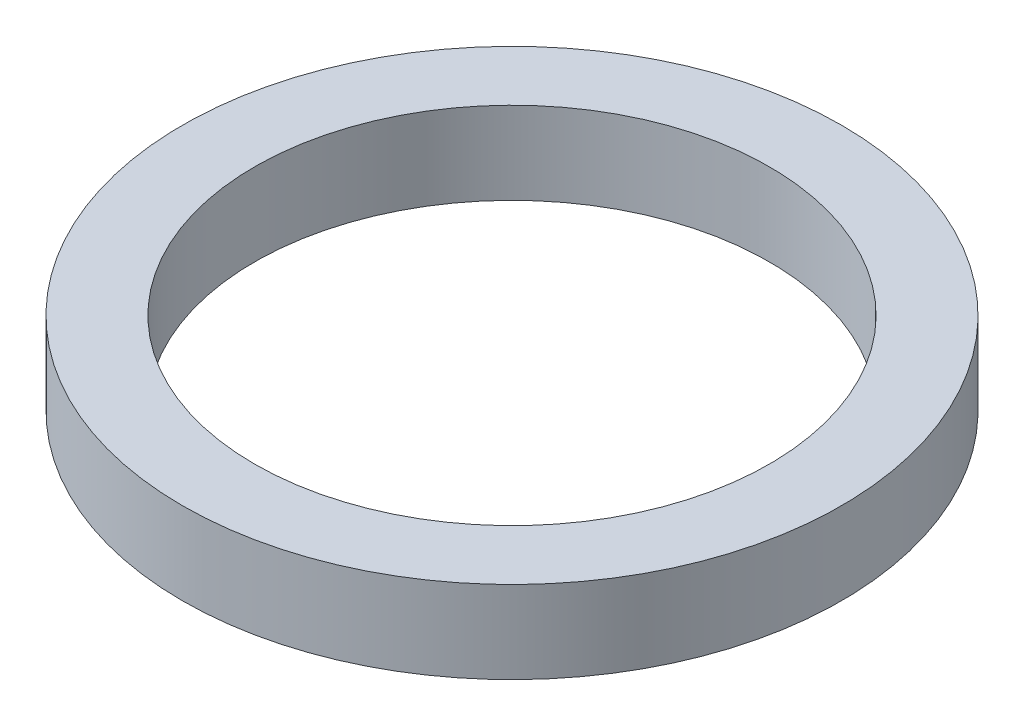
ISO-10303-21;
HEADER;
FILE_DESCRIPTION(('STEP AP214'),'2;1');
FILE_NAME('part.step','',(''),(''),'','','');
FILE_SCHEMA(('AUTOMOTIVE_DESIGN { 1 0 10303 214 1 1 1 1 }'));
ENDSEC;
DATA;
#1=APPLICATION_CONTEXT('core data for automotive mechanical design processes');
#2=APPLICATION_PROTOCOL_DEFINITION('international standard','automotive_design',2000,#1);
#3=PRODUCT_CONTEXT('',#1,'mechanical');
#4=PRODUCT('Part','Part','',(#3));
#5=PRODUCT_RELATED_PRODUCT_CATEGORY('part','',(#4));
#6=PRODUCT_DEFINITION_FORMATION('','',#4);
#7=PRODUCT_DEFINITION_CONTEXT('part definition',#1,'design');
#8=PRODUCT_DEFINITION('design','',#6,#7);
#9=PRODUCT_DEFINITION_SHAPE('','',#8);
#10=(LENGTH_UNIT() NAMED_UNIT(*) SI_UNIT(.MILLI.,.METRE.));
#11=(NAMED_UNIT(*) PLANE_ANGLE_UNIT() SI_UNIT($,.RADIAN.));
#12=(NAMED_UNIT(*) SI_UNIT($,.STERADIAN.) SOLID_ANGLE_UNIT());
#13=UNCERTAINTY_MEASURE_WITH_UNIT(LENGTH_MEASURE(1.E-05),#10,'distance_accuracy_value','');
#14=(GEOMETRIC_REPRESENTATION_CONTEXT(3) GLOBAL_UNCERTAINTY_ASSIGNED_CONTEXT((#13)) GLOBAL_UNIT_ASSIGNED_CONTEXT((#10,
#11,#12)) REPRESENTATION_CONTEXT('',''));
#15=CARTESIAN_POINT('',(0.,0.,0.));
#16=DIRECTION('',(0.,0.,1.));
#17=DIRECTION('',(1.,0.,0.));
#18=AXIS2_PLACEMENT_3D('',#15,#16,#17);
#19=CARTESIAN_POINT('',(0.,4.,0.));
#20=DIRECTION('',(0.,1.,0.));
#21=DIRECTION('',(0.,0.,1.));
#22=AXIS2_PLACEMENT_3D('',#19,#20,#21);
#23=PLANE('',#22);
#24=CARTESIAN_POINT('',(0.,4.,0.));
#25=DIRECTION('',(0.,1.,0.));
#26=DIRECTION('',(0.,0.,1.));
#27=AXIS2_PLACEMENT_3D('',#24,#25,#26);
#28=CIRCLE('',#27,16.);
#29=CARTESIAN_POINT('',(0.,4.,16.));
#30=VERTEX_POINT('',#29);
#31=EDGE_CURVE('E10',#30,#30,#28,.T.);
#32=ORIENTED_EDGE('',*,*,#31,.T.);
#33=EDGE_LOOP('',(#32));
#34=FACE_BOUND('',#33,.T.);
#35=CARTESIAN_POINT('',(0.,4.,0.));
#36=DIRECTION('',(0.,1.,0.));
#37=DIRECTION('',(0.,0.,1.));
#38=AXIS2_PLACEMENT_3D('',#35,#36,#37);
#39=CIRCLE('',#38,12.5);
#40=CARTESIAN_POINT('',(0.,4.,12.5));
#41=VERTEX_POINT('',#40);
#42=EDGE_CURVE('E45',#41,#41,#39,.T.);
#43=ORIENTED_EDGE('',*,*,#42,.F.);
#44=EDGE_LOOP('',(#43));
#45=FACE_BOUND('',#44,.T.);
#46=ADVANCED_FACE('F34',(#34,#45),#23,.T.);
#47=CARTESIAN_POINT('',(0.,0.,0.));
#48=DIRECTION('',(0.,1.,0.));
#49=DIRECTION('',(0.,0.,1.));
#50=AXIS2_PLACEMENT_3D('',#47,#48,#49);
#51=PLANE('',#50);
#52=CARTESIAN_POINT('',(0.,0.,0.));
#53=DIRECTION('',(0.,1.,0.));
#54=DIRECTION('',(0.,0.,1.));
#55=AXIS2_PLACEMENT_3D('',#52,#53,#54);
#56=CIRCLE('',#55,16.);
#57=CARTESIAN_POINT('',(0.,0.,16.));
#58=VERTEX_POINT('',#57);
#59=EDGE_CURVE('E38',#58,#58,#56,.T.);
#60=ORIENTED_EDGE('',*,*,#59,.F.);
#61=EDGE_LOOP('',(#60));
#62=FACE_BOUND('',#61,.T.);
#63=CARTESIAN_POINT('',(0.,0.,0.));
#64=DIRECTION('',(0.,1.,0.));
#65=DIRECTION('',(0.,0.,1.));
#66=AXIS2_PLACEMENT_3D('',#63,#64,#65);
#67=CIRCLE('',#66,12.5);
#68=CARTESIAN_POINT('',(0.,0.,12.5));
#69=VERTEX_POINT('',#68);
#70=EDGE_CURVE('E47',#69,#69,#67,.T.);
#71=ORIENTED_EDGE('',*,*,#70,.T.);
#72=EDGE_LOOP('',(#71));
#73=FACE_BOUND('',#72,.T.);
#74=ADVANCED_FACE('F57',(#62,#73),#51,.F.);
#75=CARTESIAN_POINT('',(0.,4.,0.));
#76=DIRECTION('',(0.,-1.,0.));
#77=DIRECTION('',(0.,0.,-1.));
#78=AXIS2_PLACEMENT_3D('',#75,#76,#77);
#79=CYLINDRICAL_SURFACE('',#78,16.);
#80=ORIENTED_EDGE('',*,*,#31,.F.);
#81=EDGE_LOOP('',(#80));
#82=FACE_BOUND('',#81,.T.);
#83=ORIENTED_EDGE('',*,*,#59,.T.);
#84=EDGE_LOOP('',(#83));
#85=FACE_BOUND('',#84,.T.);
#86=ADVANCED_FACE('F36',(#82,#85),#79,.T.);
#87=CARTESIAN_POINT('',(0.,4.,0.));
#88=DIRECTION('',(0.,-1.,0.));
#89=DIRECTION('',(0.,0.,-1.));
#90=AXIS2_PLACEMENT_3D('',#87,#88,#89);
#91=CYLINDRICAL_SURFACE('',#90,12.5);
#92=ORIENTED_EDGE('',*,*,#42,.T.);
#93=EDGE_LOOP('',(#92));
#94=FACE_BOUND('',#93,.T.);
#95=ORIENTED_EDGE('',*,*,#70,.F.);
#96=EDGE_LOOP('',(#95));
#97=FACE_BOUND('',#96,.T.);
#98=ADVANCED_FACE('F53',(#94,#97),#91,.F.);
#99=CLOSED_SHELL('',(#46,#74,#86,#98));
#100=MANIFOLD_SOLID_BREP('B2',#99);
#101=ADVANCED_BREP_SHAPE_REPRESENTATION('',(#18,#100),#14);
#102=SHAPE_DEFINITION_REPRESENTATION(#9,#101);
ENDSEC;
END-ISO-10303-21;
